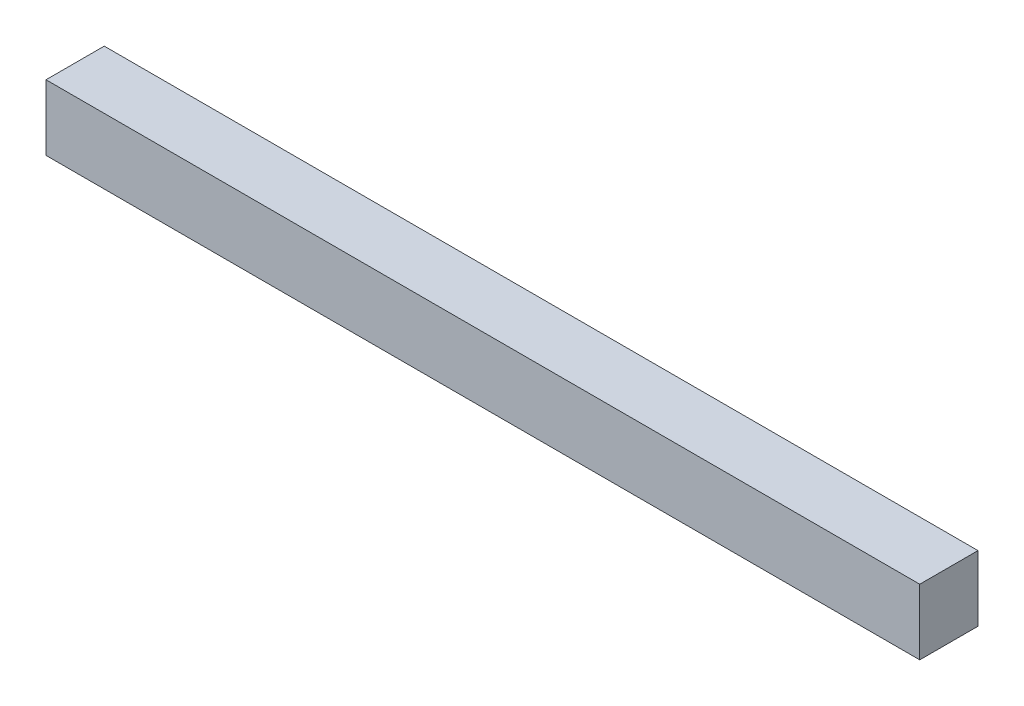
ISO-10303-21;
HEADER;
FILE_DESCRIPTION(('STEP AP214'),'2;1');
FILE_NAME('part.step','',(''),(''),'','','');
FILE_SCHEMA(('AUTOMOTIVE_DESIGN { 1 0 10303 214 1 1 1 1 }'));
ENDSEC;
DATA;
#1=APPLICATION_CONTEXT('core data for automotive mechanical design processes');
#2=APPLICATION_PROTOCOL_DEFINITION('international standard','automotive_design',2000,#1);
#3=PRODUCT_CONTEXT('',#1,'mechanical');
#4=PRODUCT('Part','Part','',(#3));
#5=PRODUCT_RELATED_PRODUCT_CATEGORY('part','',(#4));
#6=PRODUCT_DEFINITION_FORMATION('','',#4);
#7=PRODUCT_DEFINITION_CONTEXT('part definition',#1,'design');
#8=PRODUCT_DEFINITION('design','',#6,#7);
#9=PRODUCT_DEFINITION_SHAPE('','',#8);
#10=(LENGTH_UNIT() NAMED_UNIT(*) SI_UNIT(.MILLI.,.METRE.));
#11=(NAMED_UNIT(*) PLANE_ANGLE_UNIT() SI_UNIT($,.RADIAN.));
#12=(NAMED_UNIT(*) SI_UNIT($,.STERADIAN.) SOLID_ANGLE_UNIT());
#13=UNCERTAINTY_MEASURE_WITH_UNIT(LENGTH_MEASURE(1.E-05),#10,'distance_accuracy_value','');
#14=(GEOMETRIC_REPRESENTATION_CONTEXT(3) GLOBAL_UNCERTAINTY_ASSIGNED_CONTEXT((#13)) GLOBAL_UNIT_ASSIGNED_CONTEXT((#10,
#11,#12)) REPRESENTATION_CONTEXT('',''));
#15=CARTESIAN_POINT('',(0.,0.,0.));
#16=DIRECTION('',(0.,0.,1.));
#17=DIRECTION('',(1.,0.,0.));
#18=AXIS2_PLACEMENT_3D('',#15,#16,#17);
#19=CARTESIAN_POINT('',(-33.3401074324673,11.1358947368421,8.));
#20=DIRECTION('',(1.,0.,0.));
#21=DIRECTION('',(0.,0.,-1.));
#22=AXIS2_PLACEMENT_3D('',#19,#20,#21);
#23=PLANE('',#22);
#24=DIRECTION('',(0.,-1.,0.));
#25=VECTOR('',#24,1.);
#26=CARTESIAN_POINT('',(-33.3401074324673,11.1358947368421,0.));
#27=LINE('',#26,#25);
#28=CARTESIAN_POINT('',(-33.3401074324673,11.1358947368421,0.));
#29=VERTEX_POINT('',#28);
#30=CARTESIAN_POINT('',(-33.3401074324673,2.13589473684211,0.));
#31=VERTEX_POINT('',#30);
#32=EDGE_CURVE('E93',#29,#31,#27,.T.);
#33=ORIENTED_EDGE('',*,*,#32,.T.);
#34=DIRECTION('',(0.,0.,-1.));
#35=VECTOR('',#34,1.);
#36=CARTESIAN_POINT('',(-33.3401074324673,2.13589473684211,8.));
#37=LINE('',#36,#35);
#38=CARTESIAN_POINT('',(-33.3401074324673,2.13589473684211,8.));
#39=VERTEX_POINT('',#38);
#40=EDGE_CURVE('E11',#39,#31,#37,.T.);
#41=ORIENTED_EDGE('',*,*,#40,.F.);
#42=DIRECTION('',(0.,-1.,0.));
#43=VECTOR('',#42,1.);
#44=CARTESIAN_POINT('',(-33.3401074324673,11.1358947368421,8.));
#45=LINE('',#44,#43);
#46=CARTESIAN_POINT('',(-33.3401074324673,11.1358947368421,8.));
#47=VERTEX_POINT('',#46);
#48=EDGE_CURVE('E81',#47,#39,#45,.T.);
#49=ORIENTED_EDGE('',*,*,#48,.F.);
#50=DIRECTION('',(0.,0.,-1.));
#51=VECTOR('',#50,1.);
#52=CARTESIAN_POINT('',(-33.3401074324673,11.1358947368421,8.));
#53=LINE('',#52,#51);
#54=EDGE_CURVE('E89',#47,#29,#53,.T.);
#55=ORIENTED_EDGE('',*,*,#54,.T.);
#56=EDGE_LOOP('',(#33,#41,#49,#55));
#57=FACE_BOUND('',#56,.T.);
#58=ADVANCED_FACE('F30',(#57),#23,.F.);
#59=CARTESIAN_POINT('',(-33.3401074324673,2.13589473684211,8.));
#60=DIRECTION('',(0.,1.,0.));
#61=DIRECTION('',(0.,0.,1.));
#62=AXIS2_PLACEMENT_3D('',#59,#60,#61);
#63=PLANE('',#62);
#64=DIRECTION('',(1.,0.,0.));
#65=VECTOR('',#64,1.);
#66=CARTESIAN_POINT('',(-33.3401074324673,2.13589473684211,0.));
#67=LINE('',#66,#65);
#68=CARTESIAN_POINT('',(86.6598925675327,2.13589473684211,0.));
#69=VERTEX_POINT('',#68);
#70=EDGE_CURVE('E85',#31,#69,#67,.T.);
#71=ORIENTED_EDGE('',*,*,#70,.T.);
#72=DIRECTION('',(0.,0.,-1.));
#73=VECTOR('',#72,1.);
#74=CARTESIAN_POINT('',(86.6598925675327,2.13589473684211,8.));
#75=LINE('',#74,#73);
#76=CARTESIAN_POINT('',(86.6598925675327,2.13589473684211,8.));
#77=VERTEX_POINT('',#76);
#78=EDGE_CURVE('E38',#77,#69,#75,.T.);
#79=ORIENTED_EDGE('',*,*,#78,.F.);
#80=DIRECTION('',(1.,0.,0.));
#81=VECTOR('',#80,1.);
#82=CARTESIAN_POINT('',(-33.3401074324673,2.13589473684211,8.));
#83=LINE('',#82,#81);
#84=EDGE_CURVE('E76',#39,#77,#83,.T.);
#85=ORIENTED_EDGE('',*,*,#84,.F.);
#86=ORIENTED_EDGE('',*,*,#40,.T.);
#87=EDGE_LOOP('',(#71,#79,#85,#86));
#88=FACE_BOUND('',#87,.T.);
#89=ADVANCED_FACE('F84',(#88),#63,.F.);
#90=CARTESIAN_POINT('',(86.6598925675327,11.1358947368421,8.));
#91=DIRECTION('',(-1.,0.,0.));
#92=DIRECTION('',(0.,0.,1.));
#93=AXIS2_PLACEMENT_3D('',#90,#91,#92);
#94=PLANE('',#93);
#95=DIRECTION('',(0.,1.,0.));
#96=VECTOR('',#95,1.);
#97=CARTESIAN_POINT('',(86.6598925675327,11.1358947368421,0.));
#98=LINE('',#97,#96);
#99=CARTESIAN_POINT('',(86.6598925675327,11.1358947368421,0.));
#100=VERTEX_POINT('',#99);
#101=EDGE_CURVE('E63',#69,#100,#98,.T.);
#102=ORIENTED_EDGE('',*,*,#101,.T.);
#103=DIRECTION('',(0.,0.,-1.));
#104=VECTOR('',#103,1.);
#105=CARTESIAN_POINT('',(86.6598925675327,11.1358947368421,8.));
#106=LINE('',#105,#104);
#107=CARTESIAN_POINT('',(86.6598925675327,11.1358947368421,8.));
#108=VERTEX_POINT('',#107);
#109=EDGE_CURVE('E86',#108,#100,#106,.T.);
#110=ORIENTED_EDGE('',*,*,#109,.F.);
#111=DIRECTION('',(0.,1.,0.));
#112=VECTOR('',#111,1.);
#113=CARTESIAN_POINT('',(86.6598925675327,11.1358947368421,8.));
#114=LINE('',#113,#112);
#115=EDGE_CURVE('E79',#77,#108,#114,.T.);
#116=ORIENTED_EDGE('',*,*,#115,.F.);
#117=ORIENTED_EDGE('',*,*,#78,.T.);
#118=EDGE_LOOP('',(#102,#110,#116,#117));
#119=FACE_BOUND('',#118,.T.);
#120=ADVANCED_FACE('F87',(#119),#94,.F.);
#121=CARTESIAN_POINT('',(-33.3401074324673,11.1358947368421,8.));
#122=DIRECTION('',(0.,-1.,0.));
#123=DIRECTION('',(0.,0.,-1.));
#124=AXIS2_PLACEMENT_3D('',#121,#122,#123);
#125=PLANE('',#124);
#126=DIRECTION('',(-1.,0.,0.));
#127=VECTOR('',#126,1.);
#128=CARTESIAN_POINT('',(-33.3401074324673,11.1358947368421,0.));
#129=LINE('',#128,#127);
#130=EDGE_CURVE('E69',#100,#29,#129,.T.);
#131=ORIENTED_EDGE('',*,*,#130,.T.);
#132=ORIENTED_EDGE('',*,*,#54,.F.);
#133=DIRECTION('',(-1.,0.,0.));
#134=VECTOR('',#133,1.);
#135=CARTESIAN_POINT('',(-33.3401074324673,11.1358947368421,8.));
#136=LINE('',#135,#134);
#137=EDGE_CURVE('E46',#108,#47,#136,.T.);
#138=ORIENTED_EDGE('',*,*,#137,.F.);
#139=ORIENTED_EDGE('',*,*,#109,.T.);
#140=EDGE_LOOP('',(#131,#132,#138,#139));
#141=FACE_BOUND('',#140,.T.);
#142=ADVANCED_FACE('F100',(#141),#125,.F.);
#143=CARTESIAN_POINT('',(-33.3401074324673,2.13589473684211,8.));
#144=DIRECTION('',(0.,0.,1.));
#145=DIRECTION('',(1.,0.,0.));
#146=AXIS2_PLACEMENT_3D('',#143,#144,#145);
#147=PLANE('',#146);
#148=ORIENTED_EDGE('',*,*,#48,.T.);
#149=ORIENTED_EDGE('',*,*,#84,.T.);
#150=ORIENTED_EDGE('',*,*,#115,.T.);
#151=ORIENTED_EDGE('',*,*,#137,.T.);
#152=EDGE_LOOP('',(#148,#149,#150,#151));
#153=FACE_BOUND('',#152,.T.);
#154=ADVANCED_FACE('F77',(#153),#147,.T.);
#155=CARTESIAN_POINT('',(-33.3401074324673,2.13589473684211,0.));
#156=DIRECTION('',(0.,0.,1.));
#157=DIRECTION('',(1.,0.,0.));
#158=AXIS2_PLACEMENT_3D('',#155,#156,#157);
#159=PLANE('',#158);
#160=ORIENTED_EDGE('',*,*,#32,.F.);
#161=ORIENTED_EDGE('',*,*,#130,.F.);
#162=ORIENTED_EDGE('',*,*,#101,.F.);
#163=ORIENTED_EDGE('',*,*,#70,.F.);
#164=EDGE_LOOP('',(#160,#161,#162,#163));
#165=FACE_BOUND('',#164,.T.);
#166=ADVANCED_FACE('F103',(#165),#159,.F.);
#167=CLOSED_SHELL('',(#58,#89,#120,#142,#154,#166));
#168=MANIFOLD_SOLID_BREP('B2',#167);
#169=ADVANCED_BREP_SHAPE_REPRESENTATION('',(#18,#168),#14);
#170=SHAPE_DEFINITION_REPRESENTATION(#9,#169);
ENDSEC;
END-ISO-10303-21;
